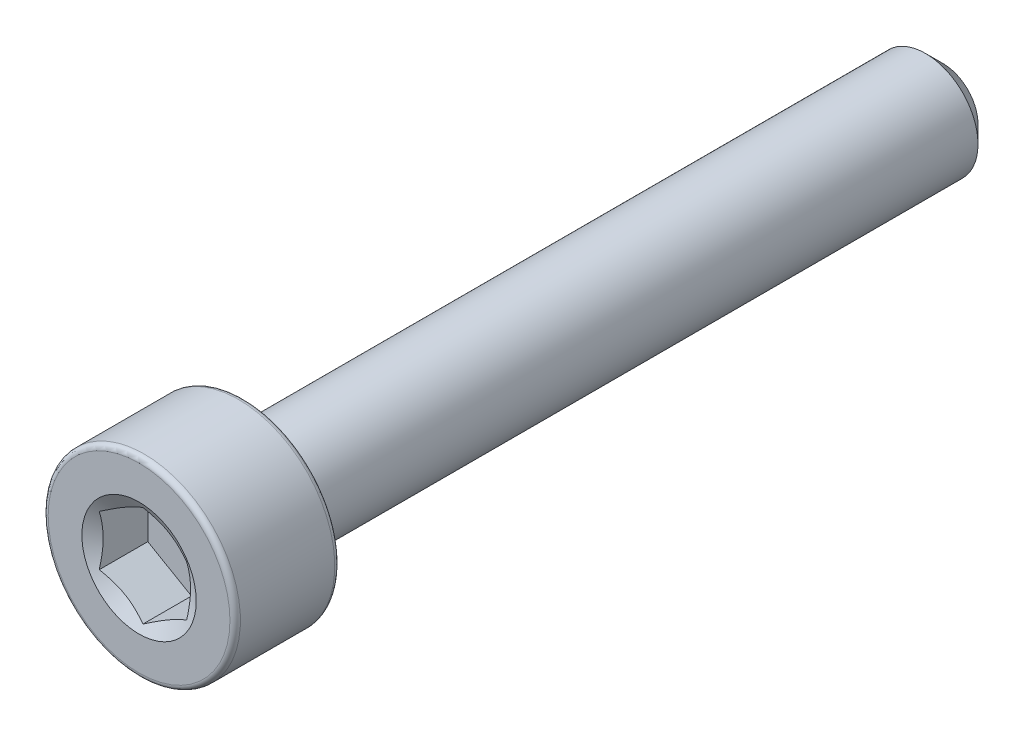
ISO-10303-21;
HEADER;
FILE_DESCRIPTION(('STEP AP214'),'2;1');
FILE_NAME('part.step','',(''),(''),'','','');
FILE_SCHEMA(('AUTOMOTIVE_DESIGN { 1 0 10303 214 1 1 1 1 }'));
ENDSEC;
DATA;
#1=APPLICATION_CONTEXT('core data for automotive mechanical design processes');
#2=APPLICATION_PROTOCOL_DEFINITION('international standard','automotive_design',2000,#1);
#3=PRODUCT_CONTEXT('',#1,'mechanical');
#4=PRODUCT('Part','Part','',(#3));
#5=PRODUCT_RELATED_PRODUCT_CATEGORY('part','',(#4));
#6=PRODUCT_DEFINITION_FORMATION('','',#4);
#7=PRODUCT_DEFINITION_CONTEXT('part definition',#1,'design');
#8=PRODUCT_DEFINITION('design','',#6,#7);
#9=PRODUCT_DEFINITION_SHAPE('','',#8);
#10=(LENGTH_UNIT() NAMED_UNIT(*) SI_UNIT(.MILLI.,.METRE.));
#11=(NAMED_UNIT(*) PLANE_ANGLE_UNIT() SI_UNIT($,.RADIAN.));
#12=(NAMED_UNIT(*) SI_UNIT($,.STERADIAN.) SOLID_ANGLE_UNIT());
#13=UNCERTAINTY_MEASURE_WITH_UNIT(LENGTH_MEASURE(1.E-05),#10,'distance_accuracy_value','');
#14=(GEOMETRIC_REPRESENTATION_CONTEXT(3) GLOBAL_UNCERTAINTY_ASSIGNED_CONTEXT((#13)) GLOBAL_UNIT_ASSIGNED_CONTEXT((#10,
#11,#12)) REPRESENTATION_CONTEXT('',''));
#15=CARTESIAN_POINT('',(0.,0.,0.));
#16=DIRECTION('',(0.,0.,1.));
#17=DIRECTION('',(1.,0.,0.));
#18=AXIS2_PLACEMENT_3D('',#15,#16,#17);
#19=CARTESIAN_POINT('',(0.,0.,-11.5));
#20=DIRECTION('',(0.,0.,-1.));
#21=DIRECTION('',(-1.,0.,0.));
#22=AXIS2_PLACEMENT_3D('',#19,#20,#21);
#23=PLANE('',#22);
#24=CARTESIAN_POINT('',(0.,0.,-11.5));
#25=DIRECTION('',(0.,0.,-1.));
#26=DIRECTION('',(-1.,0.,0.));
#27=AXIS2_PLACEMENT_3D('',#24,#25,#26);
#28=CIRCLE('',#27,1.);
#29=CARTESIAN_POINT('',(-1.,0.,-11.5));
#30=VERTEX_POINT('',#29);
#31=EDGE_CURVE('E54',#30,#30,#28,.T.);
#32=ORIENTED_EDGE('',*,*,#31,.T.);
#33=EDGE_LOOP('',(#32));
#34=FACE_BOUND('',#33,.T.);
#35=ADVANCED_FACE('F41',(#34),#23,.T.);
#36=CARTESIAN_POINT('',(0.,0.,-11.5));
#37=DIRECTION('',(0.,0.,1.));
#38=DIRECTION('',(1.,0.,0.));
#39=AXIS2_PLACEMENT_3D('',#36,#37,#38);
#40=CONICAL_SURFACE('',#39,1.,0.785398163397449);
#41=CARTESIAN_POINT('',(0.,0.,-11.));
#42=DIRECTION('',(0.,0.,-1.));
#43=DIRECTION('',(-1.,0.,0.));
#44=AXIS2_PLACEMENT_3D('',#41,#42,#43);
#45=CIRCLE('',#44,1.50000000000001);
#46=CARTESIAN_POINT('',(-1.50000000000001,0.,-11.));
#47=VERTEX_POINT('',#46);
#48=EDGE_CURVE('E139',#47,#47,#45,.T.);
#49=ORIENTED_EDGE('',*,*,#48,.T.);
#50=EDGE_LOOP('',(#49));
#51=FACE_BOUND('',#50,.T.);
#52=ORIENTED_EDGE('',*,*,#31,.F.);
#53=EDGE_LOOP('',(#52));
#54=FACE_BOUND('',#53,.T.);
#55=ADVANCED_FACE('F145',(#51,#54),#40,.T.);
#56=CARTESIAN_POINT('',(0.,0.,-11.5));
#57=DIRECTION('',(0.,0.,-1.));
#58=DIRECTION('',(-1.,0.,0.));
#59=AXIS2_PLACEMENT_3D('',#56,#57,#58);
#60=CYLINDRICAL_SURFACE('',#59,1.50000000000001);
#61=CARTESIAN_POINT('',(0.,0.,8.5));
#62=DIRECTION('',(0.,0.,-1.));
#63=DIRECTION('',(-1.,0.,0.));
#64=AXIS2_PLACEMENT_3D('',#61,#62,#63);
#65=CIRCLE('',#64,1.5);
#66=CARTESIAN_POINT('',(-1.5,0.,8.5));
#67=VERTEX_POINT('',#66);
#68=EDGE_CURVE('E136',#67,#67,#65,.T.);
#69=ORIENTED_EDGE('',*,*,#68,.T.);
#70=EDGE_LOOP('',(#69));
#71=FACE_BOUND('',#70,.T.);
#72=ORIENTED_EDGE('',*,*,#48,.F.);
#73=EDGE_LOOP('',(#72));
#74=FACE_BOUND('',#73,.T.);
#75=ADVANCED_FACE('F147',(#71,#74),#60,.T.);
#76=CARTESIAN_POINT('',(0.,1.5,8.5));
#77=DIRECTION('',(0.,0.,-1.));
#78=DIRECTION('',(-1.,0.,0.));
#79=AXIS2_PLACEMENT_3D('',#76,#77,#78);
#80=PLANE('',#79);
#81=CARTESIAN_POINT('',(0.,0.,8.5));
#82=DIRECTION('',(0.,0.,-1.));
#83=DIRECTION('',(-1.,0.,0.));
#84=AXIS2_PLACEMENT_3D('',#81,#82,#83);
#85=CIRCLE('',#84,2.6);
#86=CARTESIAN_POINT('',(-2.6,0.,8.5));
#87=VERTEX_POINT('',#86);
#88=EDGE_CURVE('E133',#87,#87,#85,.T.);
#89=ORIENTED_EDGE('',*,*,#88,.T.);
#90=EDGE_LOOP('',(#89));
#91=FACE_BOUND('',#90,.T.);
#92=ORIENTED_EDGE('',*,*,#68,.F.);
#93=EDGE_LOOP('',(#92));
#94=FACE_BOUND('',#93,.T.);
#95=ADVANCED_FACE('F153',(#91,#94),#80,.T.);
#96=CARTESIAN_POINT('',(0.,0.,8.65));
#97=DIRECTION('',(0.,0.,-1.));
#98=DIRECTION('',(-1.,0.,0.));
#99=AXIS2_PLACEMENT_3D('',#96,#97,#98);
#100=TOROIDAL_SURFACE('',#99,2.6,0.15);
#101=CARTESIAN_POINT('',(0.,0.,8.65));
#102=DIRECTION('',(0.,0.,-1.));
#103=DIRECTION('',(-1.,0.,0.));
#104=AXIS2_PLACEMENT_3D('',#101,#102,#103);
#105=CIRCLE('',#104,2.75);
#106=CARTESIAN_POINT('',(-2.75,0.,8.65));
#107=VERTEX_POINT('',#106);
#108=EDGE_CURVE('E130',#107,#107,#105,.T.);
#109=ORIENTED_EDGE('',*,*,#108,.T.);
#110=EDGE_LOOP('',(#109));
#111=FACE_BOUND('',#110,.T.);
#112=ORIENTED_EDGE('',*,*,#88,.F.);
#113=EDGE_LOOP('',(#112));
#114=FACE_BOUND('',#113,.T.);
#115=ADVANCED_FACE('F159',(#111,#114),#100,.T.);
#116=CARTESIAN_POINT('',(0.,0.,-11.5));
#117=DIRECTION('',(0.,0.,-1.));
#118=DIRECTION('',(-1.,0.,0.));
#119=AXIS2_PLACEMENT_3D('',#116,#117,#118);
#120=CYLINDRICAL_SURFACE('',#119,2.75);
#121=CARTESIAN_POINT('',(0.,0.,11.35));
#122=DIRECTION('',(0.,0.,-1.));
#123=DIRECTION('',(-1.,0.,0.));
#124=AXIS2_PLACEMENT_3D('',#121,#122,#123);
#125=CIRCLE('',#124,2.75);
#126=CARTESIAN_POINT('',(-2.75,0.,11.35));
#127=VERTEX_POINT('',#126);
#128=EDGE_CURVE('E127',#127,#127,#125,.T.);
#129=ORIENTED_EDGE('',*,*,#128,.T.);
#130=EDGE_LOOP('',(#129));
#131=FACE_BOUND('',#130,.T.);
#132=ORIENTED_EDGE('',*,*,#108,.F.);
#133=EDGE_LOOP('',(#132));
#134=FACE_BOUND('',#133,.T.);
#135=ADVANCED_FACE('F163',(#131,#134),#120,.T.);
#136=CARTESIAN_POINT('',(0.,0.,11.35));
#137=DIRECTION('',(0.,0.,-1.));
#138=DIRECTION('',(-1.,0.,0.));
#139=AXIS2_PLACEMENT_3D('',#136,#137,#138);
#140=TOROIDAL_SURFACE('',#139,2.6,0.15);
#141=CARTESIAN_POINT('',(0.,0.,11.5));
#142=DIRECTION('',(0.,0.,-1.));
#143=DIRECTION('',(-1.,0.,0.));
#144=AXIS2_PLACEMENT_3D('',#141,#142,#143);
#145=CIRCLE('',#144,2.6);
#146=CARTESIAN_POINT('',(-2.6,0.,11.5));
#147=VERTEX_POINT('',#146);
#148=EDGE_CURVE('E124',#147,#147,#145,.T.);
#149=ORIENTED_EDGE('',*,*,#148,.T.);
#150=EDGE_LOOP('',(#149));
#151=FACE_BOUND('',#150,.T.);
#152=ORIENTED_EDGE('',*,*,#128,.F.);
#153=EDGE_LOOP('',(#152));
#154=FACE_BOUND('',#153,.T.);
#155=ADVANCED_FACE('F167',(#151,#154),#140,.T.);
#156=CARTESIAN_POINT('',(0.,2.6,11.5));
#157=DIRECTION('',(0.,0.,1.));
#158=DIRECTION('',(1.,0.,0.));
#159=AXIS2_PLACEMENT_3D('',#156,#157,#158);
#160=PLANE('',#159);
#161=CARTESIAN_POINT('',(0.,0.,11.5));
#162=DIRECTION('',(0.,0.,1.));
#163=DIRECTION('',(1.,0.,0.));
#164=AXIS2_PLACEMENT_3D('',#161,#162,#163);
#165=CIRCLE('',#164,1.63614639414505);
#166=CARTESIAN_POINT('',(1.63614639414505,0.,11.5));
#167=VERTEX_POINT('',#166);
#168=EDGE_CURVE('E261',#167,#167,#165,.T.);
#169=ORIENTED_EDGE('',*,*,#168,.F.);
#170=EDGE_LOOP('',(#169));
#171=FACE_BOUND('',#170,.T.);
#172=ORIENTED_EDGE('',*,*,#148,.F.);
#173=EDGE_LOOP('',(#172));
#174=FACE_BOUND('',#173,.T.);
#175=ADVANCED_FACE('F171',(#171,#174),#160,.T.);
#176=CARTESIAN_POINT('',(0.,0.,11.5));
#177=DIRECTION('',(0.,0.,1.));
#178=DIRECTION('',(1.,0.,0.));
#179=AXIS2_PLACEMENT_3D('',#176,#177,#178);
#180=CONICAL_SURFACE('',#179,1.63614639414505,1.0471975511966);
#181=ORIENTED_EDGE('',*,*,#168,.T.);
#182=EDGE_LOOP('',(#181));
#183=FACE_BOUND('',#182,.T.);
#184=CARTESIAN_POINT('',(1.2502,0.721572366433192,11.3887704469061));
#185=CARTESIAN_POINT('',(1.19526669476823,0.753288124996228,11.3704496870037));
#186=CARTESIAN_POINT('',(1.13985921349976,0.785277649221701,11.3537870784407));
#187=CARTESIAN_POINT('',(1.02808463239966,0.849810733708401,11.3247010761858));
#188=CARTESIAN_POINT('',(0.971715545158288,0.88235544140118,11.3122879742161));
#189=CARTESIAN_POINT('',(0.859676025913014,0.947041487997315,11.2929634598761));
#190=CARTESIAN_POINT('',(0.804022841540769,0.97917286897589,11.2859234616875));
#191=CARTESIAN_POINT('',(0.692454346091608,1.04358696985655,11.2775162048707));
#192=CARTESIAN_POINT('',(0.636539441062399,1.07586945532687,11.2761419874448));
#193=CARTESIAN_POINT('',(0.532042078818275,1.13620103554812,11.278987109608));
#194=CARTESIAN_POINT('',(0.483444050118684,1.16425912049992,11.2825078710601));
#195=CARTESIAN_POINT('',(0.386564637826762,1.22019247526559,11.2936708849393));
#196=CARTESIAN_POINT('',(0.338283589807837,1.24806755133607,11.3013169578127));
#197=CARTESIAN_POINT('',(0.241204116145957,1.30411641158755,11.3204332269406));
#198=CARTESIAN_POINT('',(0.192417989648101,1.3322830948538,11.3319845292197));
#199=CARTESIAN_POINT('',(0.0955737477078982,1.38819614400745,11.3582020869339));
#200=CARTESIAN_POINT('',(0.0475143896730361,1.41594322730595,11.3728621743792));
#201=CARTESIAN_POINT('',(-0.000199999999999927,1.4434911430279,11.3887704469061));
#202=B_SPLINE_CURVE_WITH_KNOTS('',3,(#184,#185,#186,#187,#188,#189,#190,#191,#192,#193,#194,
#195,#196,#197,#198,#199,#200,#201),.UNSPECIFIED.,.F.,.F.,(4,2,2,2,2,2,2,2,4),(0.,
0.198150821029559,0.396778196315219,0.590488617354398,0.783961049317179,0.952480056398643,
1.12115539730009,1.2935743034359,1.4656542697693),.UNSPECIFIED.);
#203=CARTESIAN_POINT('',(1.25,0.72168783648703,11.3887037722401));
#204=VERTEX_POINT('',#203);
#205=CARTESIAN_POINT('',(0.,1.44337567297406,11.3887037722401));
#206=VERTEX_POINT('',#205);
#207=EDGE_CURVE('E108',#204,#206,#202,.T.);
#208=ORIENTED_EDGE('',*,*,#207,.F.);
#209=CARTESIAN_POINT('',(1.25,-1.89493751841897,11.8660049161367));
#210=CARTESIAN_POINT('',(1.25,-1.84067066556792,11.8398591369801));
#211=CARTESIAN_POINT('',(1.25,-1.78627450163045,11.8139771801041));
#212=CARTESIAN_POINT('',(1.25,-1.67715428612257,11.7628901449648));
#213=CARTESIAN_POINT('',(1.25,-1.62243018009227,11.737685183164));
#214=CARTESIAN_POINT('',(1.25,-1.51228150662671,11.6879651495794));
#215=CARTESIAN_POINT('',(1.25,-1.45685471366199,11.6634549865724));
#216=CARTESIAN_POINT('',(1.25,-1.34554530713432,11.6154991246428));
#217=CARTESIAN_POINT('',(1.25,-1.28966271673333,11.5920533720234));
#218=CARTESIAN_POINT('',(1.25,-1.17576624469794,11.5458644070182));
#219=CARTESIAN_POINT('',(1.25,-1.11773662340457,11.5231594973456));
#220=CARTESIAN_POINT('',(1.25,-1.00099484940808,11.4795841161114));
#221=CARTESIAN_POINT('',(1.25,-0.942282613121023,11.4587138719349));
#222=CARTESIAN_POINT('',(1.25,-0.765204349699313,11.3997072191848));
#223=CARTESIAN_POINT('',(1.25,-0.645583882604636,11.3650422189823));
#224=CARTESIAN_POINT('',(1.25,-0.463875702211922,11.3244838282877));
#225=CARTESIAN_POINT('',(1.25,-0.403068506127652,11.3128844610448));
#226=CARTESIAN_POINT('',(1.25,-0.280742753477134,11.2942518454792));
#227=CARTESIAN_POINT('',(1.25,-0.219224254752231,11.2872182285025));
#228=CARTESIAN_POINT('',(1.25,-0.096569876363301,11.2783680226508));
#229=CARTESIAN_POINT('',(1.25,-0.0354387064012572,11.2764878457648));
#230=CARTESIAN_POINT('',(1.25,0.0867606380980661,11.2779328141762));
#231=CARTESIAN_POINT('',(1.25,0.147828809103269,11.2812582369791));
#232=CARTESIAN_POINT('',(1.25,0.296976974537503,11.2954442054338));
#233=CARTESIAN_POINT('',(1.25,0.384798095194577,11.3090299024726));
#234=CARTESIAN_POINT('',(1.25,0.558777035598954,11.3444719080705));
#235=CARTESIAN_POINT('',(1.25,0.644932779103953,11.3663379185543));
#236=CARTESIAN_POINT('',(1.25,0.773809145216829,11.4038729521391));
#237=CARTESIAN_POINT('',(1.25,0.817192381770242,11.4173527933513));
#238=CARTESIAN_POINT('',(1.25,0.903507427606639,11.4456064722738));
#239=CARTESIAN_POINT('',(1.25,0.946439496819678,11.4603795133203));
#240=CARTESIAN_POINT('',(1.25,1.03190818876533,11.4910007062678));
#241=CARTESIAN_POINT('',(1.25,1.07444487146017,11.5068486920207));
#242=CARTESIAN_POINT('',(1.25,1.15917932142556,11.5394435314668));
#243=CARTESIAN_POINT('',(1.25,1.20137703158446,11.5561905331241));
#244=CARTESIAN_POINT('',(1.25,1.31147066876873,11.6010154406074));
#245=CARTESIAN_POINT('',(1.25,1.37912101231521,11.629695951964));
#246=CARTESIAN_POINT('',(1.25,1.51378271027518,11.6885240272895));
#247=CARTESIAN_POINT('',(1.25,1.58079400938027,11.7186717168868));
#248=CARTESIAN_POINT('',(1.25,1.78108956690742,11.810786011249));
#249=CARTESIAN_POINT('',(1.25,1.91360872407254,11.8744125929199));
#250=CARTESIAN_POINT('',(1.25,2.1774904257741,12.0044258505658));
#251=CARTESIAN_POINT('',(1.25,2.3088511775619,12.0708161192718));
#252=CARTESIAN_POINT('',(1.25,2.57065126493254,12.2053391118779));
#253=CARTESIAN_POINT('',(1.25,2.70109073234425,12.2734715797604));
#254=CARTESIAN_POINT('',(1.25,2.948502633735,12.4041482033026));
#255=CARTESIAN_POINT('',(1.25,3.06553428022911,12.4665806590823));
#256=CARTESIAN_POINT('',(1.25,3.29922001609874,12.5921595961625));
#257=CARTESIAN_POINT('',(1.25,3.41587408905205,12.6553061079975));
#258=CARTESIAN_POINT('',(1.25,3.64856969129762,12.7819563109881));
#259=CARTESIAN_POINT('',(1.25,3.76461202239064,12.8454585309991));
#260=CARTESIAN_POINT('',(1.25,3.99646186524789,12.9728743669845));
#261=CARTESIAN_POINT('',(1.25,4.1122693903372,13.036787958703));
#262=CARTESIAN_POINT('',(1.25,4.2279932107486,13.1008518334656));
#263=B_SPLINE_CURVE_WITH_KNOTS('',3,(#209,#210,#211,#212,#213,#214,#215,#216,#217,#218,#219,
#220,#221,#222,#223,#224,#225,#226,#227,#228,#229,#230,#231,#232,#233,#234,#235,#236,#237,#238,
#239,#240,#241,#242,#243,#244,#245,#246,#247,#248,#249,#250,#251,#252,#253,#254,#255,#256,#257,
#258,#259,#260,#261,#262),.UNSPECIFIED.,.F.,.F.,(4,2,2,2,2,2,2,2,2,2,2,2,2,2,2,2,2,2,2,2,2,2,2,
2,2,2,4),(0.,0.180713106713345,0.361457104680117,0.543260352914664,0.725054419431096,
0.911961247339337,1.09889120758174,1.4717330826098,1.65730634847845,1.84286462866529,
2.02612278279417,2.20939070656818,2.47544204670161,2.74180608477099,2.87807807884381,
3.01426670678608,3.15043433259021,3.28662443861176,3.50703539675674,3.72746526112046,
4.1684120268283,4.60995110059888,5.05142565856186,5.44935247283762,5.84729636804963,
6.24413951205772,6.64095946715193),.UNSPECIFIED.);
#264=CARTESIAN_POINT('',(1.25,-0.72168783648703,11.3887037722401));
#265=VERTEX_POINT('',#264);
#266=EDGE_CURVE('E217',#265,#204,#263,.T.);
#267=ORIENTED_EDGE('',*,*,#266,.F.);
#268=CARTESIAN_POINT('',(-0.000200000000000775,-1.4434911430279,11.3887704469061));
#269=CARTESIAN_POINT('',(0.054733305231764,-1.41177538446486,11.3704496870037));
#270=CARTESIAN_POINT('',(0.110140786500238,-1.37978586023939,11.3537870784407));
#271=CARTESIAN_POINT('',(0.221915367600338,-1.31525277575269,11.3247010761858));
#272=CARTESIAN_POINT('',(0.278284454841709,-1.28270806805991,11.3122879742161));
#273=CARTESIAN_POINT('',(0.390323974086982,-1.21802202146378,11.2929634598761));
#274=CARTESIAN_POINT('',(0.445977158459227,-1.1858906404852,11.2859234616875));
#275=CARTESIAN_POINT('',(0.557545653908389,-1.12147653960455,11.2775162048707));
#276=CARTESIAN_POINT('',(0.613460558937598,-1.08919405413422,11.2761419874448));
#277=CARTESIAN_POINT('',(0.717957921181722,-1.02886247391297,11.278987109608));
#278=CARTESIAN_POINT('',(0.766555949881313,-1.00080438896118,11.2825078710601));
#279=CARTESIAN_POINT('',(0.863435362173235,-0.944871034195501,11.2936708849393));
#280=CARTESIAN_POINT('',(0.91171641019216,-0.916995958125018,11.3013169578127));
#281=CARTESIAN_POINT('',(1.00879588385404,-0.860947097873544,11.3204332269406));
#282=CARTESIAN_POINT('',(1.0575820103519,-0.832780414607288,11.3319845292197));
#283=CARTESIAN_POINT('',(1.1544262522921,-0.776867365453646,11.3582020869339));
#284=CARTESIAN_POINT('',(1.20248561032696,-0.749120282155138,11.3728621743792));
#285=CARTESIAN_POINT('',(1.2502,-0.721572366433192,11.3887704469061));
#286=B_SPLINE_CURVE_WITH_KNOTS('',3,(#268,#269,#270,#271,#272,#273,#274,#275,#276,#277,#278,
#279,#280,#281,#282,#283,#284,#285),.UNSPECIFIED.,.F.,.F.,(4,2,2,2,2,2,2,2,4),(0.,
0.198150821029559,0.396778196315219,0.590488617354398,0.783961049317179,0.952480056398644,
1.1211553973001,1.2935743034359,1.4656542697693),.UNSPECIFIED.);
#287=CARTESIAN_POINT('',(0.,-1.44337567297406,11.3887037722401));
#288=VERTEX_POINT('',#287);
#289=EDGE_CURVE('E211',#288,#265,#286,.T.);
#290=ORIENTED_EDGE('',*,*,#289,.F.);
#291=CARTESIAN_POINT('',(-1.2502,-0.721572366433193,11.3887704469061));
#292=CARTESIAN_POINT('',(-1.19526669476823,-0.753288124996229,11.3704496870037));
#293=CARTESIAN_POINT('',(-1.13985921349976,-0.785277649221702,11.3537870784407));
#294=CARTESIAN_POINT('',(-1.02808463239966,-0.849810733708402,11.3247010761858));
#295=CARTESIAN_POINT('',(-0.971715545158287,-0.882355441401181,11.3122879742161));
#296=CARTESIAN_POINT('',(-0.859676025913014,-0.947041487997316,11.2929634598761));
#297=CARTESIAN_POINT('',(-0.804022841540769,-0.979172868975891,11.2859234616875));
#298=CARTESIAN_POINT('',(-0.692454346091607,-1.04358696985655,11.2775162048707));
#299=CARTESIAN_POINT('',(-0.636539441062398,-1.07586945532687,11.2761419874448));
#300=CARTESIAN_POINT('',(-0.532042078818274,-1.13620103554812,11.278987109608));
#301=CARTESIAN_POINT('',(-0.483444050118684,-1.16425912049992,11.2825078710601));
#302=CARTESIAN_POINT('',(-0.386564637826761,-1.22019247526559,11.2936708849393));
#303=CARTESIAN_POINT('',(-0.338283589807836,-1.24806755133607,11.3013169578127));
#304=CARTESIAN_POINT('',(-0.241204116145957,-1.30411641158755,11.3204332269406));
#305=CARTESIAN_POINT('',(-0.192417989648101,-1.3322830948538,11.3319845292197));
#306=CARTESIAN_POINT('',(-0.0955737477078988,-1.38819614400745,11.3582020869339));
#307=CARTESIAN_POINT('',(-0.0475143896730367,-1.41594322730595,11.3728621743792));
#308=CARTESIAN_POINT('',(0.000199999999999103,-1.4434911430279,11.3887704469061));
#309=B_SPLINE_CURVE_WITH_KNOTS('',3,(#291,#292,#293,#294,#295,#296,#297,#298,#299,#300,#301,
#302,#303,#304,#305,#306,#307,#308),.UNSPECIFIED.,.F.,.F.,(4,2,2,2,2,2,2,2,4),(0.,
0.198150821029559,0.39677819631522,0.590488617354398,0.783961049317179,0.952480056398643,
1.12115539730009,1.29357430343589,1.4656542697693),.UNSPECIFIED.);
#310=CARTESIAN_POINT('',(-1.25,-0.721687836487031,11.3887037722401));
#311=VERTEX_POINT('',#310);
#312=EDGE_CURVE('E61',#311,#288,#309,.T.);
#313=ORIENTED_EDGE('',*,*,#312,.F.);
#314=CARTESIAN_POINT('',(-1.25,-1.89493751838585,11.8660049161208));
#315=CARTESIAN_POINT('',(-1.25,-1.84067066553591,11.8398591369648));
#316=CARTESIAN_POINT('',(-1.25,-1.78627450159955,11.8139771800894));
#317=CARTESIAN_POINT('',(-1.25,-1.6771542860939,11.7628901449515));
#318=CARTESIAN_POINT('',(-1.25,-1.62243018006471,11.7376851831514));
#319=CARTESIAN_POINT('',(-1.25,-1.51228150660141,11.6879651495682));
#320=CARTESIAN_POINT('',(-1.25,-1.45685471363782,11.6634549865618));
#321=CARTESIAN_POINT('',(-1.25,-1.34554530711243,11.6154991246335));
#322=CARTESIAN_POINT('',(-1.25,-1.28966271671259,11.5920533720148));
#323=CARTESIAN_POINT('',(-1.25,-1.17576624467955,11.5458644070109));
#324=CARTESIAN_POINT('',(-1.25,-1.1177366233874,11.523159497339));
#325=CARTESIAN_POINT('',(-1.25,-1.00099484939336,11.4795841161061));
#326=CARTESIAN_POINT('',(-1.25,-0.942282613107529,11.4587138719302));
#327=CARTESIAN_POINT('',(-1.25,-0.765204349689551,11.3997072191819));
#328=CARTESIAN_POINT('',(-1.25,-0.645583882597419,11.3650422189805));
#329=CARTESIAN_POINT('',(-1.25,-0.463875702209307,11.3244838282872));
#330=CARTESIAN_POINT('',(-1.25,-0.403068506127044,11.3128844610447));
#331=CARTESIAN_POINT('',(-1.25,-0.280742753480583,11.2942518454797));
#332=CARTESIAN_POINT('',(-1.25,-0.219224254757731,11.2872182285031));
#333=CARTESIAN_POINT('',(-1.25,-0.0965698763728669,11.2783680226513));
#334=CARTESIAN_POINT('',(-1.25,-0.0354387064128378,11.2764878457651));
#335=CARTESIAN_POINT('',(-1.25,0.0867606380824919,11.2779328141757));
#336=CARTESIAN_POINT('',(-1.25,0.147828809085716,11.2812582369779));
#337=CARTESIAN_POINT('',(-1.25,0.296976974516786,11.2954442054311));
#338=CARTESIAN_POINT('',(-1.25,0.384798095172698,11.3090299024689));
#339=CARTESIAN_POINT('',(-1.25,0.558777035574826,11.3444719080648));
#340=CARTESIAN_POINT('',(-1.25,0.64493277907874,11.3663379185477));
#341=CARTESIAN_POINT('',(-1.25,0.773809145189989,11.403872952131));
#342=CARTESIAN_POINT('',(-1.25,0.817192381742849,11.4173527933427));
#343=CARTESIAN_POINT('',(-1.25,0.903507427578147,11.4456064722641));
#344=CARTESIAN_POINT('',(-1.25,0.946439496790638,11.4603795133102));
#345=CARTESIAN_POINT('',(-1.25,1.0319081887352,11.4910007062567));
#346=CARTESIAN_POINT('',(-1.25,1.07444487142949,11.5068486920092));
#347=CARTESIAN_POINT('',(-1.25,1.1591793213938,11.5394435314543));
#348=CARTESIAN_POINT('',(-1.25,1.20137703155215,11.5561905331112));
#349=CARTESIAN_POINT('',(-1.25,1.31147066873608,11.6010154405937));
#350=CARTESIAN_POINT('',(-1.25,1.37912101228275,11.6296959519501));
#351=CARTESIAN_POINT('',(-1.25,1.51378271024307,11.6885240272752));
#352=CARTESIAN_POINT('',(-1.25,1.58079400934832,11.7186717168723));
#353=CARTESIAN_POINT('',(-1.25,1.78108956687593,11.8107860112341));
#354=CARTESIAN_POINT('',(-1.25,1.91360872404133,11.8744125929048));
#355=CARTESIAN_POINT('',(-1.25,2.1774904257434,12.0044258505504));
#356=CARTESIAN_POINT('',(-1.25,2.30885117753144,12.0708161192563));
#357=CARTESIAN_POINT('',(-1.25,2.57065126490253,12.2053391118623));
#358=CARTESIAN_POINT('',(-1.25,2.70109073231445,12.2734715797448));
#359=CARTESIAN_POINT('',(-1.25,2.94850263370539,12.4041482032869));
#360=CARTESIAN_POINT('',(-1.25,3.06553428019949,12.4665806590664));
#361=CARTESIAN_POINT('',(-1.25,3.29922001606907,12.5921595961465));
#362=CARTESIAN_POINT('',(-1.25,3.41587408902236,12.6553061079814));
#363=CARTESIAN_POINT('',(-1.25,3.64856969126785,12.7819563109719));
#364=CARTESIAN_POINT('',(-1.25,3.76461202236081,12.8454585309827));
#365=CARTESIAN_POINT('',(-1.25,3.99646186521794,12.972874366968));
#366=CARTESIAN_POINT('',(-1.25,4.11226939030719,13.0367879586864));
#367=CARTESIAN_POINT('',(-1.25,4.22799321071853,13.1008518334489));
#368=B_SPLINE_CURVE_WITH_KNOTS('',3,(#314,#315,#316,#317,#318,#319,#320,#321,#322,#323,#324,
#325,#326,#327,#328,#329,#330,#331,#332,#333,#334,#335,#336,#337,#338,#339,#340,#341,#342,#343,
#344,#345,#346,#347,#348,#349,#350,#351,#352,#353,#354,#355,#356,#357,#358,#359,#360,#361,#362,
#363,#364,#365,#366,#367),.UNSPECIFIED.,.F.,.F.,(4,2,2,2,2,2,2,2,2,2,2,2,2,2,2,2,2,2,2,2,2,2,2,
2,2,2,4),(0.,0.180713106709462,0.361457104672351,0.543260352902969,0.725054419415468,
0.911961247319593,1.09889120755788,1.47173308257774,1.65730634844025,1.84286462862096,
2.02612278274385,2.20939070651185,2.4754420466414,2.74180608470687,2.87807807877767,
3.0142667067179,3.15043433252002,3.28662443853954,3.50703539668476,3.72746526104871,
4.16841202675703,4.60995110052814,5.05142565849164,5.44935247276722,5.84729636797905,
6.24413951198687,6.64095946708081),.UNSPECIFIED.);
#369=CARTESIAN_POINT('',(-1.25,0.721687836487031,11.3887037722401));
#370=VERTEX_POINT('',#369);
#371=EDGE_CURVE('E11',#370,#311,#368,.F.);
#372=ORIENTED_EDGE('',*,*,#371,.F.);
#373=CARTESIAN_POINT('',(0.000199999999999633,1.4434911430279,11.3887704469061));
#374=CARTESIAN_POINT('',(-0.0547333052317655,1.41177538446486,11.3704496870037));
#375=CARTESIAN_POINT('',(-0.11014078650024,1.37978586023939,11.3537870784407));
#376=CARTESIAN_POINT('',(-0.22191536760034,1.31525277575269,11.3247010761858));
#377=CARTESIAN_POINT('',(-0.27828445484171,1.28270806805991,11.3122879742161));
#378=CARTESIAN_POINT('',(-0.390323974086984,1.21802202146378,11.2929634598761));
#379=CARTESIAN_POINT('',(-0.445977158459228,1.1858906404852,11.2859234616875));
#380=CARTESIAN_POINT('',(-0.55754565390839,1.12147653960455,11.2775162048707));
#381=CARTESIAN_POINT('',(-0.613460558937599,1.08919405413422,11.2761419874448));
#382=CARTESIAN_POINT('',(-0.717957921181723,1.02886247391297,11.278987109608));
#383=CARTESIAN_POINT('',(-0.766555949881314,1.00080438896118,11.2825078710601));
#384=CARTESIAN_POINT('',(-0.863435362173236,0.944871034195502,11.2936708849393));
#385=CARTESIAN_POINT('',(-0.911716410192161,0.916995958125018,11.3013169578127));
#386=CARTESIAN_POINT('',(-1.00879588385404,0.860947097873545,11.3204332269406));
#387=CARTESIAN_POINT('',(-1.0575820103519,0.832780414607288,11.3319845292197));
#388=CARTESIAN_POINT('',(-1.1544262522921,0.776867365453647,11.3582020869339));
#389=CARTESIAN_POINT('',(-1.20248561032696,0.749120282155139,11.3728621743792));
#390=CARTESIAN_POINT('',(-1.2502,0.721572366433193,11.3887704469061));
#391=B_SPLINE_CURVE_WITH_KNOTS('',3,(#373,#374,#375,#376,#377,#378,#379,#380,#381,#382,#383,
#384,#385,#386,#387,#388,#389,#390),.UNSPECIFIED.,.F.,.F.,(4,2,2,2,2,2,2,2,4),(0.,
0.198150821029559,0.396778196315219,0.590488617354398,0.783961049317179,0.952480056398643,
1.12115539730009,1.29357430343589,1.4656542697693),.UNSPECIFIED.);
#392=EDGE_CURVE('E99',#206,#370,#391,.T.);
#393=ORIENTED_EDGE('',*,*,#392,.F.);
#394=EDGE_LOOP('',(#208,#267,#290,#313,#372,#393));
#395=FACE_BOUND('',#394,.T.);
#396=ADVANCED_FACE('F98',(#183,#395),#180,.F.);
#397=CARTESIAN_POINT('',(0.,0.,10.));
#398=DIRECTION('',(0.,0.,1.));
#399=DIRECTION('',(1.,0.,0.));
#400=AXIS2_PLACEMENT_3D('',#397,#398,#399);
#401=PLANE('',#400);
#402=DIRECTION('',(-0.866025403784438,-0.5,0.));
#403=VECTOR('',#402,1.);
#404=CARTESIAN_POINT('',(0.,1.44337567297406,10.));
#405=LINE('',#404,#403);
#406=CARTESIAN_POINT('',(0.,1.44337567297406,10.));
#407=VERTEX_POINT('',#406);
#408=CARTESIAN_POINT('',(-1.25,0.721687836487031,10.));
#409=VERTEX_POINT('',#408);
#410=EDGE_CURVE('E107',#407,#409,#405,.T.);
#411=ORIENTED_EDGE('',*,*,#410,.T.);
#412=DIRECTION('',(0.,-1.,0.));
#413=VECTOR('',#412,1.);
#414=CARTESIAN_POINT('',(-1.25,0.721687836487031,10.));
#415=LINE('',#414,#413);
#416=CARTESIAN_POINT('',(-1.25,-0.721687836487031,10.));
#417=VERTEX_POINT('',#416);
#418=EDGE_CURVE('E112',#409,#417,#415,.T.);
#419=ORIENTED_EDGE('',*,*,#418,.T.);
#420=DIRECTION('',(0.866025403784439,-0.5,0.));
#421=VECTOR('',#420,1.);
#422=CARTESIAN_POINT('',(-1.25,-0.721687836487031,10.));
#423=LINE('',#422,#421);
#424=CARTESIAN_POINT('',(0.,-1.44337567297406,10.));
#425=VERTEX_POINT('',#424);
#426=EDGE_CURVE('E243',#417,#425,#423,.T.);
#427=ORIENTED_EDGE('',*,*,#426,.T.);
#428=DIRECTION('',(0.866025403784439,0.5,0.));
#429=VECTOR('',#428,1.);
#430=CARTESIAN_POINT('',(0.,-1.44337567297406,10.));
#431=LINE('',#430,#429);
#432=CARTESIAN_POINT('',(1.25,-0.72168783648703,10.));
#433=VERTEX_POINT('',#432);
#434=EDGE_CURVE('E247',#425,#433,#431,.T.);
#435=ORIENTED_EDGE('',*,*,#434,.T.);
#436=DIRECTION('',(0.,1.,0.));
#437=VECTOR('',#436,1.);
#438=CARTESIAN_POINT('',(1.25,-0.72168783648703,10.));
#439=LINE('',#438,#437);
#440=CARTESIAN_POINT('',(1.25,0.72168783648703,10.));
#441=VERTEX_POINT('',#440);
#442=EDGE_CURVE('E120',#433,#441,#439,.T.);
#443=ORIENTED_EDGE('',*,*,#442,.T.);
#444=DIRECTION('',(-0.866025403784438,0.5,0.));
#445=VECTOR('',#444,1.);
#446=CARTESIAN_POINT('',(1.25,0.72168783648703,10.));
#447=LINE('',#446,#445);
#448=EDGE_CURVE('E115',#441,#407,#447,.T.);
#449=ORIENTED_EDGE('',*,*,#448,.T.);
#450=EDGE_LOOP('',(#411,#419,#427,#435,#443,#449));
#451=FACE_BOUND('',#450,.T.);
#452=ADVANCED_FACE('F197',(#451),#401,.T.);
#453=CARTESIAN_POINT('',(-1.25,0.721687836487031,10.));
#454=DIRECTION('',(-1.,0.,0.));
#455=DIRECTION('',(0.,0.,1.));
#456=AXIS2_PLACEMENT_3D('',#453,#454,#455);
#457=PLANE('',#456);
#458=DIRECTION('',(0.,0.,1.));
#459=VECTOR('',#458,1.);
#460=CARTESIAN_POINT('',(-1.25,0.721687836487031,10.));
#461=LINE('',#460,#459);
#462=EDGE_CURVE('E105',#409,#370,#461,.T.);
#463=ORIENTED_EDGE('',*,*,#462,.T.);
#464=ORIENTED_EDGE('',*,*,#371,.T.);
#465=DIRECTION('',(0.,0.,1.));
#466=VECTOR('',#465,1.);
#467=CARTESIAN_POINT('',(-1.25,-0.721687836487031,10.));
#468=LINE('',#467,#466);
#469=EDGE_CURVE('E114',#417,#311,#468,.T.);
#470=ORIENTED_EDGE('',*,*,#469,.F.);
#471=ORIENTED_EDGE('',*,*,#418,.F.);
#472=EDGE_LOOP('',(#463,#464,#470,#471));
#473=FACE_BOUND('',#472,.T.);
#474=ADVANCED_FACE('F110',(#473),#457,.F.);
#475=CARTESIAN_POINT('',(-1.25,-0.721687836487031,10.));
#476=DIRECTION('',(-0.5,-0.866025403784438,0.));
#477=DIRECTION('',(0.866025403784439,-0.5,0.));
#478=AXIS2_PLACEMENT_3D('',#475,#476,#477);
#479=PLANE('',#478);
#480=ORIENTED_EDGE('',*,*,#469,.T.);
#481=ORIENTED_EDGE('',*,*,#312,.T.);
#482=DIRECTION('',(0.,0.,1.));
#483=VECTOR('',#482,1.);
#484=CARTESIAN_POINT('',(0.,-1.44337567297406,10.));
#485=LINE('',#484,#483);
#486=EDGE_CURVE('E117',#425,#288,#485,.T.);
#487=ORIENTED_EDGE('',*,*,#486,.F.);
#488=ORIENTED_EDGE('',*,*,#426,.F.);
#489=EDGE_LOOP('',(#480,#481,#487,#488));
#490=FACE_BOUND('',#489,.T.);
#491=ADVANCED_FACE('F232',(#490),#479,.F.);
#492=CARTESIAN_POINT('',(0.,-1.44337567297406,10.));
#493=DIRECTION('',(0.5,-0.866025403784439,0.));
#494=DIRECTION('',(0.866025403784439,0.5,0.));
#495=AXIS2_PLACEMENT_3D('',#492,#493,#494);
#496=PLANE('',#495);
#497=ORIENTED_EDGE('',*,*,#486,.T.);
#498=ORIENTED_EDGE('',*,*,#289,.T.);
#499=DIRECTION('',(0.,0.,1.));
#500=VECTOR('',#499,1.);
#501=CARTESIAN_POINT('',(1.25,-0.72168783648703,10.));
#502=LINE('',#501,#500);
#503=EDGE_CURVE('E257',#433,#265,#502,.T.);
#504=ORIENTED_EDGE('',*,*,#503,.F.);
#505=ORIENTED_EDGE('',*,*,#434,.F.);
#506=EDGE_LOOP('',(#497,#498,#504,#505));
#507=FACE_BOUND('',#506,.T.);
#508=ADVANCED_FACE('F227',(#507),#496,.F.);
#509=CARTESIAN_POINT('',(1.25,-0.72168783648703,10.));
#510=DIRECTION('',(1.,0.,0.));
#511=DIRECTION('',(0.,1.,0.));
#512=AXIS2_PLACEMENT_3D('',#509,#510,#511);
#513=PLANE('',#512);
#514=ORIENTED_EDGE('',*,*,#503,.T.);
#515=ORIENTED_EDGE('',*,*,#266,.T.);
#516=DIRECTION('',(0.,0.,1.));
#517=VECTOR('',#516,1.);
#518=CARTESIAN_POINT('',(1.25,0.72168783648703,10.));
#519=LINE('',#518,#517);
#520=EDGE_CURVE('E254',#441,#204,#519,.T.);
#521=ORIENTED_EDGE('',*,*,#520,.F.);
#522=ORIENTED_EDGE('',*,*,#442,.F.);
#523=EDGE_LOOP('',(#514,#515,#521,#522));
#524=FACE_BOUND('',#523,.T.);
#525=ADVANCED_FACE('F224',(#524),#513,.F.);
#526=CARTESIAN_POINT('',(1.25,0.72168783648703,10.));
#527=DIRECTION('',(0.5,0.866025403784438,0.));
#528=DIRECTION('',(-0.866025403784438,0.5,0.));
#529=AXIS2_PLACEMENT_3D('',#526,#527,#528);
#530=PLANE('',#529);
#531=ORIENTED_EDGE('',*,*,#520,.T.);
#532=ORIENTED_EDGE('',*,*,#207,.T.);
#533=DIRECTION('',(0.,0.,1.));
#534=VECTOR('',#533,1.);
#535=CARTESIAN_POINT('',(0.,1.44337567297406,10.));
#536=LINE('',#535,#534);
#537=EDGE_CURVE('E68',#407,#206,#536,.T.);
#538=ORIENTED_EDGE('',*,*,#537,.F.);
#539=ORIENTED_EDGE('',*,*,#448,.F.);
#540=EDGE_LOOP('',(#531,#532,#538,#539));
#541=FACE_BOUND('',#540,.T.);
#542=ADVANCED_FACE('F178',(#541),#530,.F.);
#543=CARTESIAN_POINT('',(0.,1.44337567297406,10.));
#544=DIRECTION('',(-0.5,0.866025403784439,0.));
#545=DIRECTION('',(-0.866025403784439,-0.5,0.));
#546=AXIS2_PLACEMENT_3D('',#543,#544,#545);
#547=PLANE('',#546);
#548=ORIENTED_EDGE('',*,*,#537,.T.);
#549=ORIENTED_EDGE('',*,*,#392,.T.);
#550=ORIENTED_EDGE('',*,*,#462,.F.);
#551=ORIENTED_EDGE('',*,*,#410,.F.);
#552=EDGE_LOOP('',(#548,#549,#550,#551));
#553=FACE_BOUND('',#552,.T.);
#554=ADVANCED_FACE('F104',(#553),#547,.F.);
#555=CLOSED_SHELL('',(#35,#55,#75,#95,#115,#135,#155,#175,#396,#452,#474,#491,#508,#525,#542,#554));
#556=MANIFOLD_SOLID_BREP('B2',#555);
#557=ADVANCED_BREP_SHAPE_REPRESENTATION('',(#18,#556),#14);
#558=SHAPE_DEFINITION_REPRESENTATION(#9,#557);
ENDSEC;
END-ISO-10303-21;
